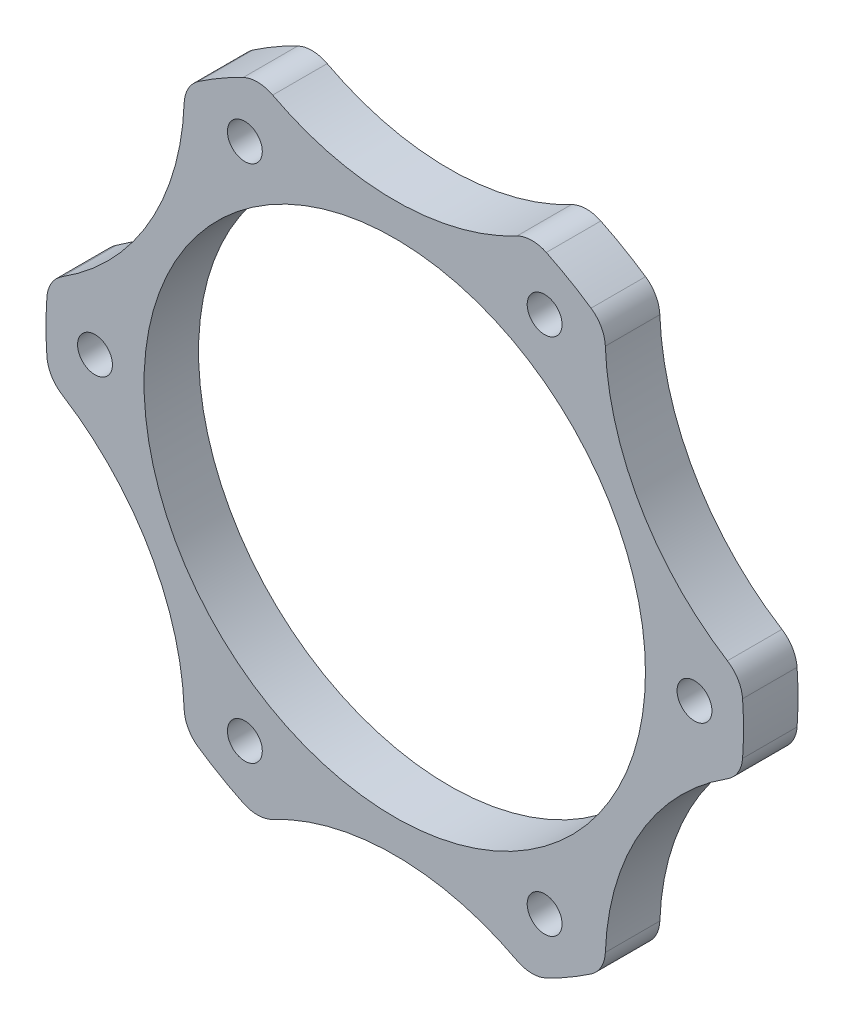
ISO-10303-21;
HEADER;
FILE_DESCRIPTION(('STEP AP214'),'2;1');
FILE_NAME('part.step','',(''),(''),'','','');
FILE_SCHEMA(('AUTOMOTIVE_DESIGN { 1 0 10303 214 1 1 1 1 }'));
ENDSEC;
DATA;
#1=APPLICATION_CONTEXT('core data for automotive mechanical design processes');
#2=APPLICATION_PROTOCOL_DEFINITION('international standard','automotive_design',2000,#1);
#3=PRODUCT_CONTEXT('',#1,'mechanical');
#4=PRODUCT('Part','Part','',(#3));
#5=PRODUCT_RELATED_PRODUCT_CATEGORY('part','',(#4));
#6=PRODUCT_DEFINITION_FORMATION('','',#4);
#7=PRODUCT_DEFINITION_CONTEXT('part definition',#1,'design');
#8=PRODUCT_DEFINITION('design','',#6,#7);
#9=PRODUCT_DEFINITION_SHAPE('','',#8);
#10=(LENGTH_UNIT() NAMED_UNIT(*) SI_UNIT(.MILLI.,.METRE.));
#11=(NAMED_UNIT(*) PLANE_ANGLE_UNIT() SI_UNIT($,.RADIAN.));
#12=(NAMED_UNIT(*) SI_UNIT($,.STERADIAN.) SOLID_ANGLE_UNIT());
#13=UNCERTAINTY_MEASURE_WITH_UNIT(LENGTH_MEASURE(1.E-05),#10,'distance_accuracy_value','');
#14=(GEOMETRIC_REPRESENTATION_CONTEXT(3) GLOBAL_UNCERTAINTY_ASSIGNED_CONTEXT((#13)) GLOBAL_UNIT_ASSIGNED_CONTEXT((#10,
#11,#12)) REPRESENTATION_CONTEXT('',''));
#15=CARTESIAN_POINT('',(0.,0.,0.));
#16=DIRECTION('',(0.,0.,1.));
#17=DIRECTION('',(1.,0.,0.));
#18=AXIS2_PLACEMENT_3D('',#15,#16,#17);
#19=CARTESIAN_POINT('',(0.,0.,5.));
#20=DIRECTION('',(0.,0.,-1.));
#21=DIRECTION('',(-1.,0.,0.));
#22=AXIS2_PLACEMENT_3D('',#19,#20,#21);
#23=CYLINDRICAL_SURFACE('',#22,32.);
#24=CARTESIAN_POINT('',(0.,0.,5.));
#25=DIRECTION('',(0.,0.,1.));
#26=DIRECTION('',(1.,0.,0.));
#27=AXIS2_PLACEMENT_3D('',#24,#25,#26);
#28=CIRCLE('',#27,32.);
#29=CARTESIAN_POINT('',(-18.0092350539192,-26.451227812196,5.));
#30=VERTEX_POINT('',#29);
#31=CARTESIAN_POINT('',(-13.9028177196915,-28.8220689655172,5.));
#32=VERTEX_POINT('',#31);
#33=EDGE_CURVE('E228',#30,#32,#28,.T.);
#34=ORIENTED_EDGE('',*,*,#33,.F.);
#35=DIRECTION('',(0.,0.,-1.));
#36=VECTOR('',#35,1.);
#37=CARTESIAN_POINT('',(-18.0092350539192,-26.451227812196,5.));
#38=LINE('',#37,#36);
#39=CARTESIAN_POINT('',(-18.0092350539192,-26.451227812196,0.));
#40=VERTEX_POINT('',#39);
#41=EDGE_CURVE('E474',#30,#40,#38,.T.);
#42=ORIENTED_EDGE('',*,*,#41,.T.);
#43=CARTESIAN_POINT('',(0.,0.,0.));
#44=DIRECTION('',(0.,0.,1.));
#45=DIRECTION('',(1.,0.,0.));
#46=AXIS2_PLACEMENT_3D('',#43,#44,#45);
#47=CIRCLE('',#46,32.);
#48=CARTESIAN_POINT('',(-13.9028177196915,-28.8220689655172,0.));
#49=VERTEX_POINT('',#48);
#50=EDGE_CURVE('E511',#40,#49,#47,.T.);
#51=ORIENTED_EDGE('',*,*,#50,.T.);
#52=DIRECTION('',(0.,0.,-1.));
#53=VECTOR('',#52,1.);
#54=CARTESIAN_POINT('',(-13.9028177196915,-28.8220689655172,5.));
#55=LINE('',#54,#53);
#56=EDGE_CURVE('E472',#49,#32,#55,.F.);
#57=ORIENTED_EDGE('',*,*,#56,.T.);
#58=EDGE_LOOP('',(#34,#42,#51,#57));
#59=FACE_BOUND('',#58,.T.);
#60=ADVANCED_FACE('F39',(#59),#23,.T.);
#61=CARTESIAN_POINT('',(-31.9120527736108,2.37084115332127,5.));
#62=VERTEX_POINT('',#61);
#63=CARTESIAN_POINT('',(-31.9120527736107,-2.37084115332151,5.));
#64=VERTEX_POINT('',#63);
#65=EDGE_CURVE('E276',#62,#64,#28,.T.);
#66=ORIENTED_EDGE('',*,*,#65,.F.);
#67=DIRECTION('',(0.,0.,-1.));
#68=VECTOR('',#67,1.);
#69=CARTESIAN_POINT('',(-31.9120527736108,2.37084115332127,5.));
#70=LINE('',#69,#68);
#71=CARTESIAN_POINT('',(-31.9120527736108,2.37084115332127,0.));
#72=VERTEX_POINT('',#71);
#73=EDGE_CURVE('E458',#62,#72,#70,.T.);
#74=ORIENTED_EDGE('',*,*,#73,.T.);
#75=CARTESIAN_POINT('',(-31.9120527736107,-2.37084115332151,0.));
#76=VERTEX_POINT('',#75);
#77=EDGE_CURVE('E513',#72,#76,#47,.T.);
#78=ORIENTED_EDGE('',*,*,#77,.T.);
#79=DIRECTION('',(0.,0.,-1.));
#80=VECTOR('',#79,1.);
#81=CARTESIAN_POINT('',(-31.9120527736107,-2.37084115332151,5.));
#82=LINE('',#81,#80);
#83=EDGE_CURVE('E461',#76,#64,#82,.F.);
#84=ORIENTED_EDGE('',*,*,#83,.T.);
#85=EDGE_LOOP('',(#66,#74,#78,#84));
#86=FACE_BOUND('',#85,.T.);
#87=ADVANCED_FACE('F380',(#86),#23,.T.);
#88=CARTESIAN_POINT('',(13.9028177196915,-28.8220689655172,5.));
#89=VERTEX_POINT('',#88);
#90=CARTESIAN_POINT('',(18.0092350539195,-26.4512278121957,5.));
#91=VERTEX_POINT('',#90);
#92=EDGE_CURVE('E229',#89,#91,#28,.T.);
#93=ORIENTED_EDGE('',*,*,#92,.F.);
#94=DIRECTION('',(0.,0.,-1.));
#95=VECTOR('',#94,1.);
#96=CARTESIAN_POINT('',(13.9028177196915,-28.8220689655172,5.));
#97=LINE('',#96,#95);
#98=CARTESIAN_POINT('',(13.9028177196915,-28.8220689655172,0.));
#99=VERTEX_POINT('',#98);
#100=EDGE_CURVE('E484',#89,#99,#97,.T.);
#101=ORIENTED_EDGE('',*,*,#100,.T.);
#102=CARTESIAN_POINT('',(18.0092350539195,-26.4512278121957,0.));
#103=VERTEX_POINT('',#102);
#104=EDGE_CURVE('E359',#99,#103,#47,.T.);
#105=ORIENTED_EDGE('',*,*,#104,.T.);
#106=DIRECTION('',(0.,0.,-1.));
#107=VECTOR('',#106,1.);
#108=CARTESIAN_POINT('',(18.0092350539195,-26.4512278121957,5.));
#109=LINE('',#108,#107);
#110=EDGE_CURVE('E481',#103,#91,#109,.F.);
#111=ORIENTED_EDGE('',*,*,#110,.T.);
#112=EDGE_LOOP('',(#93,#101,#105,#111));
#113=FACE_BOUND('',#112,.T.);
#114=ADVANCED_FACE('F385',(#113),#23,.T.);
#115=CARTESIAN_POINT('',(31.9120527736108,-2.37084115332104,5.));
#116=VERTEX_POINT('',#115);
#117=CARTESIAN_POINT('',(31.9120527736107,2.37084115332171,5.));
#118=VERTEX_POINT('',#117);
#119=EDGE_CURVE('E225',#116,#118,#28,.T.);
#120=ORIENTED_EDGE('',*,*,#119,.F.);
#121=DIRECTION('',(0.,0.,-1.));
#122=VECTOR('',#121,1.);
#123=CARTESIAN_POINT('',(31.9120527736108,-2.37084115332104,5.));
#124=LINE('',#123,#122);
#125=CARTESIAN_POINT('',(31.9120527736108,-2.37084115332104,0.));
#126=VERTEX_POINT('',#125);
#127=EDGE_CURVE('E12',#116,#126,#124,.T.);
#128=ORIENTED_EDGE('',*,*,#127,.T.);
#129=CARTESIAN_POINT('',(31.9120527736107,2.37084115332171,0.));
#130=VERTEX_POINT('',#129);
#131=EDGE_CURVE('E278',#126,#130,#47,.T.);
#132=ORIENTED_EDGE('',*,*,#131,.T.);
#133=DIRECTION('',(0.,0.,-1.));
#134=VECTOR('',#133,1.);
#135=CARTESIAN_POINT('',(31.9120527736107,2.37084115332171,5.));
#136=LINE('',#135,#134);
#137=EDGE_CURVE('E47',#130,#118,#136,.F.);
#138=ORIENTED_EDGE('',*,*,#137,.T.);
#139=EDGE_LOOP('',(#120,#128,#132,#138));
#140=FACE_BOUND('',#139,.T.);
#141=ADVANCED_FACE('F443',(#140),#23,.T.);
#142=CARTESIAN_POINT('',(-13.9028177196915,28.8220689655172,5.));
#143=VERTEX_POINT('',#142);
#144=CARTESIAN_POINT('',(-18.0092350539193,26.4512278121959,5.));
#145=VERTEX_POINT('',#144);
#146=EDGE_CURVE('E236',#143,#145,#28,.T.);
#147=ORIENTED_EDGE('',*,*,#146,.F.);
#148=DIRECTION('',(0.,0.,-1.));
#149=VECTOR('',#148,1.);
#150=CARTESIAN_POINT('',(-13.9028177196915,28.8220689655172,5.));
#151=LINE('',#150,#149);
#152=CARTESIAN_POINT('',(-13.9028177196915,28.8220689655172,0.));
#153=VERTEX_POINT('',#152);
#154=EDGE_CURVE('E538',#143,#153,#151,.T.);
#155=ORIENTED_EDGE('',*,*,#154,.T.);
#156=CARTESIAN_POINT('',(-18.0092350539193,26.4512278121959,0.));
#157=VERTEX_POINT('',#156);
#158=EDGE_CURVE('E226',#153,#157,#47,.T.);
#159=ORIENTED_EDGE('',*,*,#158,.T.);
#160=DIRECTION('',(0.,0.,-1.));
#161=VECTOR('',#160,1.);
#162=CARTESIAN_POINT('',(-18.0092350539193,26.4512278121959,5.));
#163=LINE('',#162,#161);
#164=EDGE_CURVE('E542',#157,#145,#163,.F.);
#165=ORIENTED_EDGE('',*,*,#164,.T.);
#166=EDGE_LOOP('',(#147,#155,#159,#165));
#167=FACE_BOUND('',#166,.T.);
#168=ADVANCED_FACE('F377',(#167),#23,.T.);
#169=CARTESIAN_POINT('',(0.,0.,5.));
#170=DIRECTION('',(0.,0.,1.));
#171=DIRECTION('',(1.,0.,0.));
#172=AXIS2_PLACEMENT_3D('',#169,#170,#171);
#173=PLANE('',#172);
#174=CARTESIAN_POINT('',(-13.7500000000001,23.815698604072,5.));
#175=DIRECTION('',(0.,0.,1.));
#176=DIRECTION('',(0.499999999999998,0.86602540378444,0.));
#177=AXIS2_PLACEMENT_3D('',#174,#175,#176);
#178=CIRCLE('',#177,1.6);
#179=CARTESIAN_POINT('',(-12.9500000000001,25.2013392501271,5.));
#180=VERTEX_POINT('',#179);
#181=EDGE_CURVE('E572',#180,#180,#178,.T.);
#182=ORIENTED_EDGE('',*,*,#181,.F.);
#183=EDGE_LOOP('',(#182));
#184=FACE_BOUND('',#183,.T.);
#185=CARTESIAN_POINT('',(-27.5,-1.97758476261356E-13,5.));
#186=DIRECTION('',(0.,0.,1.));
#187=DIRECTION('',(-0.500000000000004,0.866025403784436,0.));
#188=AXIS2_PLACEMENT_3D('',#185,#186,#187);
#189=CIRCLE('',#188,1.6);
#190=CARTESIAN_POINT('',(-28.3,1.3856406460549,5.));
#191=VERTEX_POINT('',#190);
#192=EDGE_CURVE('E739',#191,#191,#189,.T.);
#193=ORIENTED_EDGE('',*,*,#192,.F.);
#194=EDGE_LOOP('',(#193));
#195=FACE_BOUND('',#194,.T.);
#196=CARTESIAN_POINT('',(-13.7499999999999,-23.8156986040721,5.));
#197=DIRECTION('',(0.,0.,1.));
#198=DIRECTION('',(-1.,0.,0.));
#199=AXIS2_PLACEMENT_3D('',#196,#197,#198);
#200=CIRCLE('',#199,1.6);
#201=CARTESIAN_POINT('',(-15.3499999999999,-23.8156986040721,5.));
#202=VERTEX_POINT('',#201);
#203=EDGE_CURVE('E743',#202,#202,#200,.T.);
#204=ORIENTED_EDGE('',*,*,#203,.F.);
#205=EDGE_LOOP('',(#204));
#206=FACE_BOUND('',#205,.T.);
#207=CARTESIAN_POINT('',(13.7500000000003,-23.8156986040719,5.));
#208=DIRECTION('',(0.,0.,1.));
#209=DIRECTION('',(-0.499999999999992,-0.866025403784443,0.));
#210=AXIS2_PLACEMENT_3D('',#207,#208,#209);
#211=CIRCLE('',#210,1.6);
#212=CARTESIAN_POINT('',(12.9500000000003,-25.201339250127,5.));
#213=VERTEX_POINT('',#212);
#214=EDGE_CURVE('E747',#213,#213,#211,.T.);
#215=ORIENTED_EDGE('',*,*,#214,.F.);
#216=EDGE_LOOP('',(#215));
#217=FACE_BOUND('',#216,.T.);
#218=CARTESIAN_POINT('',(27.5,3.92047505570758E-13,5.));
#219=DIRECTION('',(0.,0.,1.));
#220=DIRECTION('',(0.50000000000001,-0.866025403784433,0.));
#221=AXIS2_PLACEMENT_3D('',#218,#219,#220);
#222=CIRCLE('',#221,1.6);
#223=CARTESIAN_POINT('',(28.3,-1.3856406460547,5.));
#224=VERTEX_POINT('',#223);
#225=EDGE_CURVE('E558',#224,#224,#222,.T.);
#226=ORIENTED_EDGE('',*,*,#225,.F.);
#227=EDGE_LOOP('',(#226));
#228=FACE_BOUND('',#227,.T.);
#229=CARTESIAN_POINT('',(13.7499999999999,23.8156986040721,5.));
#230=DIRECTION('',(0.,0.,1.));
#231=DIRECTION('',(1.,0.,0.));
#232=AXIS2_PLACEMENT_3D('',#229,#230,#231);
#233=CIRCLE('',#232,1.6);
#234=CARTESIAN_POINT('',(15.3499999999999,23.8156986040721,5.));
#235=VERTEX_POINT('',#234);
#236=EDGE_CURVE('E553',#235,#235,#233,.T.);
#237=ORIENTED_EDGE('',*,*,#236,.F.);
#238=EDGE_LOOP('',(#237));
#239=FACE_BOUND('',#238,.T.);
#240=CARTESIAN_POINT('',(43.3012701892216,25.0000000000005,5.));
#241=DIRECTION('',(0.,0.,1.));
#242=DIRECTION('',(0.50000000000001,-0.866025403784433,0.));
#243=AXIS2_PLACEMENT_3D('',#240,#241,#242);
#244=CIRCLE('',#243,24.);
#245=CARTESIAN_POINT('',(19.3186915922371,24.085711293158,5.));
#246=VERTEX_POINT('',#245);
#247=CARTESIAN_POINT('',(30.518183644211,4.68762204017589,5.));
#248=VERTEX_POINT('',#247);
#249=EDGE_CURVE('E209',#246,#248,#244,.T.);
#250=ORIENTED_EDGE('',*,*,#249,.F.);
#251=CARTESIAN_POINT('',(16.320869267614,23.9714252048027,5.));
#252=DIRECTION('',(0.,0.,1.));
#253=DIRECTION('',(1.,0.,0.));
#254=AXIS2_PLACEMENT_3D('',#251,#252,#253);
#255=CIRCLE('',#254,3.);
#256=CARTESIAN_POINT('',(18.0092350539189,26.4512278121961,5.));
#257=VERTEX_POINT('',#256);
#258=EDGE_CURVE('E203',#246,#257,#255,.T.);
#259=ORIENTED_EDGE('',*,*,#258,.T.);
#260=CARTESIAN_POINT('',(13.9028177196915,28.8220689655172,5.));
#261=VERTEX_POINT('',#260);
#262=EDGE_CURVE('E207',#257,#261,#28,.T.);
#263=ORIENTED_EDGE('',*,*,#262,.T.);
#264=CARTESIAN_POINT('',(12.5994285584704,26.12,5.));
#265=DIRECTION('',(0.,0.,1.));
#266=DIRECTION('',(1.,0.,0.));
#267=AXIS2_PLACEMENT_3D('',#264,#265,#266);
#268=CIRCLE('',#267,3.);
#269=CARTESIAN_POINT('',(11.1994920519737,28.7733333333333,5.));
#270=VERTEX_POINT('',#269);
#271=EDGE_CURVE('E214',#261,#270,#268,.T.);
#272=ORIENTED_EDGE('',*,*,#271,.T.);
#273=CARTESIAN_POINT('',(0.,50.,5.));
#274=DIRECTION('',(0.,0.,1.));
#275=DIRECTION('',(1.,0.,0.));
#276=AXIS2_PLACEMENT_3D('',#273,#274,#275);
#277=CIRCLE('',#276,24.);
#278=CARTESIAN_POINT('',(-11.1994920519737,28.7733333333333,5.));
#279=VERTEX_POINT('',#278);
#280=EDGE_CURVE('E344',#279,#270,#277,.T.);
#281=ORIENTED_EDGE('',*,*,#280,.F.);
#282=CARTESIAN_POINT('',(-12.5994285584704,26.12,5.));
#283=DIRECTION('',(0.,0.,1.));
#284=DIRECTION('',(1.,0.,0.));
#285=AXIS2_PLACEMENT_3D('',#282,#283,#284);
#286=CIRCLE('',#285,3.);
#287=EDGE_CURVE('E338',#279,#143,#286,.T.);
#288=ORIENTED_EDGE('',*,*,#287,.T.);
#289=ORIENTED_EDGE('',*,*,#146,.T.);
#290=CARTESIAN_POINT('',(-16.3208692676144,23.9714252048025,5.));
#291=DIRECTION('',(0.,0.,1.));
#292=DIRECTION('',(1.,0.,0.));
#293=AXIS2_PLACEMENT_3D('',#290,#291,#292);
#294=CIRCLE('',#293,3.);
#295=CARTESIAN_POINT('',(-19.3186915922375,24.0857112931578,5.));
#296=VERTEX_POINT('',#295);
#297=EDGE_CURVE('E334',#145,#296,#294,.T.);
#298=ORIENTED_EDGE('',*,*,#297,.T.);
#299=CARTESIAN_POINT('',(-43.301270189222,24.9999999999999,5.));
#300=DIRECTION('',(0.,0.,1.));
#301=DIRECTION('',(0.499999999999998,0.86602540378444,0.));
#302=AXIS2_PLACEMENT_3D('',#299,#300,#301);
#303=CIRCLE('',#302,24.);
#304=CARTESIAN_POINT('',(-30.5181836442111,4.68762204017546,5.));
#305=VERTEX_POINT('',#304);
#306=EDGE_CURVE('E324',#305,#296,#303,.T.);
#307=ORIENTED_EDGE('',*,*,#306,.F.);
#308=CARTESIAN_POINT('',(-28.9202978260848,2.1485747951974,5.));
#309=DIRECTION('',(0.,0.,1.));
#310=DIRECTION('',(1.,0.,0.));
#311=AXIS2_PLACEMENT_3D('',#308,#309,#310);
#312=CIRCLE('',#311,3.);
#313=EDGE_CURVE('E331',#305,#62,#312,.T.);
#314=ORIENTED_EDGE('',*,*,#313,.T.);
#315=ORIENTED_EDGE('',*,*,#65,.T.);
#316=CARTESIAN_POINT('',(-28.9202978260847,-2.14857479519762,5.));
#317=DIRECTION('',(0.,0.,1.));
#318=DIRECTION('',(1.,0.,0.));
#319=AXIS2_PLACEMENT_3D('',#316,#317,#318);
#320=CIRCLE('',#319,3.);
#321=CARTESIAN_POINT('',(-30.5181836442111,-4.68762204017568,5.));
#322=VERTEX_POINT('',#321);
#323=EDGE_CURVE('E328',#64,#322,#320,.T.);
#324=ORIENTED_EDGE('',*,*,#323,.T.);
#325=CARTESIAN_POINT('',(-43.3012701892218,-25.0000000000002,5.));
#326=DIRECTION('',(0.,0.,1.));
#327=DIRECTION('',(-0.500000000000004,0.866025403784436,0.));
#328=AXIS2_PLACEMENT_3D('',#325,#326,#327);
#329=CIRCLE('',#328,24.);
#330=CARTESIAN_POINT('',(-19.3186915922373,-24.0857112931579,5.));
#331=VERTEX_POINT('',#330);
#332=EDGE_CURVE('E318',#331,#322,#329,.T.);
#333=ORIENTED_EDGE('',*,*,#332,.F.);
#334=CARTESIAN_POINT('',(-16.3208692676142,-23.9714252048026,5.));
#335=DIRECTION('',(0.,0.,1.));
#336=DIRECTION('',(1.,0.,0.));
#337=AXIS2_PLACEMENT_3D('',#334,#335,#336);
#338=CIRCLE('',#337,3.);
#339=EDGE_CURVE('E62',#331,#30,#338,.T.);
#340=ORIENTED_EDGE('',*,*,#339,.T.);
#341=ORIENTED_EDGE('',*,*,#33,.T.);
#342=CARTESIAN_POINT('',(-12.5994285584704,-26.12,5.));
#343=DIRECTION('',(0.,0.,1.));
#344=DIRECTION('',(1.,0.,0.));
#345=AXIS2_PLACEMENT_3D('',#342,#343,#344);
#346=CIRCLE('',#345,3.);
#347=CARTESIAN_POINT('',(-11.1994920519737,-28.7733333333333,5.));
#348=VERTEX_POINT('',#347);
#349=EDGE_CURVE('E54',#32,#348,#346,.T.);
#350=ORIENTED_EDGE('',*,*,#349,.T.);
#351=CARTESIAN_POINT('',(0.,-50.,5.));
#352=DIRECTION('',(0.,0.,1.));
#353=DIRECTION('',(-1.,0.,0.));
#354=AXIS2_PLACEMENT_3D('',#351,#352,#353);
#355=CIRCLE('',#354,24.);
#356=CARTESIAN_POINT('',(11.1994920519737,-28.7733333333333,5.));
#357=VERTEX_POINT('',#356);
#358=EDGE_CURVE('E313',#357,#348,#355,.T.);
#359=ORIENTED_EDGE('',*,*,#358,.F.);
#360=CARTESIAN_POINT('',(12.5994285584704,-26.12,5.));
#361=DIRECTION('',(0.,0.,1.));
#362=DIRECTION('',(1.,0.,0.));
#363=AXIS2_PLACEMENT_3D('',#360,#361,#362);
#364=CIRCLE('',#363,3.);
#365=EDGE_CURVE('E305',#357,#89,#364,.T.);
#366=ORIENTED_EDGE('',*,*,#365,.T.);
#367=ORIENTED_EDGE('',*,*,#92,.T.);
#368=CARTESIAN_POINT('',(16.3208692676146,-23.9714252048024,5.));
#369=DIRECTION('',(0.,0.,1.));
#370=DIRECTION('',(1.,0.,0.));
#371=AXIS2_PLACEMENT_3D('',#368,#369,#370);
#372=CIRCLE('',#371,3.);
#373=CARTESIAN_POINT('',(19.3186915922376,-24.0857112931576,5.));
#374=VERTEX_POINT('',#373);
#375=EDGE_CURVE('E303',#91,#374,#372,.T.);
#376=ORIENTED_EDGE('',*,*,#375,.T.);
#377=CARTESIAN_POINT('',(43.3012701892222,-24.9999999999996,5.));
#378=DIRECTION('',(0.,0.,1.));
#379=DIRECTION('',(-0.499999999999992,-0.866025403784443,0.));
#380=AXIS2_PLACEMENT_3D('',#377,#378,#379);
#381=CIRCLE('',#380,24.);
#382=CARTESIAN_POINT('',(30.5181836442111,-4.68762204017524,5.));
#383=VERTEX_POINT('',#382);
#384=EDGE_CURVE('E319',#383,#374,#381,.T.);
#385=ORIENTED_EDGE('',*,*,#384,.F.);
#386=CARTESIAN_POINT('',(28.9202978260848,-2.1485747951972,5.));
#387=DIRECTION('',(0.,0.,1.));
#388=DIRECTION('',(1.,0.,0.));
#389=AXIS2_PLACEMENT_3D('',#386,#387,#388);
#390=CIRCLE('',#389,3.);
#391=EDGE_CURVE('E267',#383,#116,#390,.T.);
#392=ORIENTED_EDGE('',*,*,#391,.T.);
#393=ORIENTED_EDGE('',*,*,#119,.T.);
#394=CARTESIAN_POINT('',(28.9202978260847,2.1485747951978,5.));
#395=DIRECTION('',(0.,0.,1.));
#396=DIRECTION('',(1.,0.,0.));
#397=AXIS2_PLACEMENT_3D('',#394,#395,#396);
#398=CIRCLE('',#397,3.);
#399=EDGE_CURVE('E264',#118,#248,#398,.T.);
#400=ORIENTED_EDGE('',*,*,#399,.T.);
#401=EDGE_LOOP('',(#250,#259,#263,#272,#281,#288,#289,#298,#307,#314,#315,#324,#333,#340,#341,
#350,#359,#366,#367,#376,#385,#392,#393,#400));
#402=FACE_BOUND('',#401,.T.);
#403=CARTESIAN_POINT('',(0.,0.,5.));
#404=DIRECTION('',(0.,0.,1.));
#405=DIRECTION('',(1.,0.,0.));
#406=AXIS2_PLACEMENT_3D('',#403,#404,#405);
#407=CIRCLE('',#406,23.);
#408=CARTESIAN_POINT('',(23.,0.,5.));
#409=VERTEX_POINT('',#408);
#410=EDGE_CURVE('E353',#409,#409,#407,.T.);
#411=ORIENTED_EDGE('',*,*,#410,.F.);
#412=EDGE_LOOP('',(#411));
#413=FACE_BOUND('',#412,.T.);
#414=ADVANCED_FACE('F205',(#184,#195,#206,#217,#228,#239,#402,#413),#173,.T.);
#415=CARTESIAN_POINT('',(0.,0.,0.));
#416=DIRECTION('',(0.,0.,1.));
#417=DIRECTION('',(1.,0.,0.));
#418=AXIS2_PLACEMENT_3D('',#415,#416,#417);
#419=PLANE('',#418);
#420=CARTESIAN_POINT('',(-13.7500000000001,23.815698604072,0.));
#421=DIRECTION('',(0.,0.,1.));
#422=DIRECTION('',(1.,0.,0.));
#423=AXIS2_PLACEMENT_3D('',#420,#421,#422);
#424=CIRCLE('',#423,1.6);
#425=CARTESIAN_POINT('',(-12.1500000000001,23.815698604072,0.));
#426=VERTEX_POINT('',#425);
#427=EDGE_CURVE('E557',#426,#426,#424,.T.);
#428=ORIENTED_EDGE('',*,*,#427,.T.);
#429=EDGE_LOOP('',(#428));
#430=FACE_BOUND('',#429,.T.);
#431=CARTESIAN_POINT('',(-27.5,-1.97758476261356E-13,0.));
#432=DIRECTION('',(0.,0.,1.));
#433=DIRECTION('',(1.,0.,0.));
#434=AXIS2_PLACEMENT_3D('',#431,#432,#433);
#435=CIRCLE('',#434,1.6);
#436=CARTESIAN_POINT('',(-25.9,-1.97758476261356E-13,0.));
#437=VERTEX_POINT('',#436);
#438=EDGE_CURVE('E578',#437,#437,#435,.T.);
#439=ORIENTED_EDGE('',*,*,#438,.T.);
#440=EDGE_LOOP('',(#439));
#441=FACE_BOUND('',#440,.T.);
#442=CARTESIAN_POINT('',(-13.7499999999999,-23.8156986040721,0.));
#443=DIRECTION('',(0.,0.,1.));
#444=DIRECTION('',(1.,0.,0.));
#445=AXIS2_PLACEMENT_3D('',#442,#443,#444);
#446=CIRCLE('',#445,1.6);
#447=CARTESIAN_POINT('',(-12.1499999999999,-23.8156986040721,0.));
#448=VERTEX_POINT('',#447);
#449=EDGE_CURVE('E575',#448,#448,#446,.T.);
#450=ORIENTED_EDGE('',*,*,#449,.T.);
#451=EDGE_LOOP('',(#450));
#452=FACE_BOUND('',#451,.T.);
#453=CARTESIAN_POINT('',(13.7500000000003,-23.8156986040719,0.));
#454=DIRECTION('',(0.,0.,1.));
#455=DIRECTION('',(1.,0.,0.));
#456=AXIS2_PLACEMENT_3D('',#453,#454,#455);
#457=CIRCLE('',#456,1.6);
#458=CARTESIAN_POINT('',(15.3500000000003,-23.8156986040719,0.));
#459=VERTEX_POINT('',#458);
#460=EDGE_CURVE('E571',#459,#459,#457,.T.);
#461=ORIENTED_EDGE('',*,*,#460,.T.);
#462=EDGE_LOOP('',(#461));
#463=FACE_BOUND('',#462,.T.);
#464=CARTESIAN_POINT('',(27.5,3.92047505570758E-13,0.));
#465=DIRECTION('',(0.,0.,1.));
#466=DIRECTION('',(1.,0.,0.));
#467=AXIS2_PLACEMENT_3D('',#464,#465,#466);
#468=CIRCLE('',#467,1.6);
#469=CARTESIAN_POINT('',(29.1,3.92047505570758E-13,0.));
#470=VERTEX_POINT('',#469);
#471=EDGE_CURVE('E568',#470,#470,#468,.T.);
#472=ORIENTED_EDGE('',*,*,#471,.T.);
#473=EDGE_LOOP('',(#472));
#474=FACE_BOUND('',#473,.T.);
#475=CARTESIAN_POINT('',(13.7499999999999,23.8156986040721,0.));
#476=DIRECTION('',(0.,0.,1.));
#477=DIRECTION('',(1.,0.,0.));
#478=AXIS2_PLACEMENT_3D('',#475,#476,#477);
#479=CIRCLE('',#478,1.6);
#480=CARTESIAN_POINT('',(15.3499999999999,23.8156986040721,0.));
#481=VERTEX_POINT('',#480);
#482=EDGE_CURVE('E556',#481,#481,#479,.T.);
#483=ORIENTED_EDGE('',*,*,#482,.T.);
#484=EDGE_LOOP('',(#483));
#485=FACE_BOUND('',#484,.T.);
#486=CARTESIAN_POINT('',(18.0092350539189,26.4512278121961,0.));
#487=VERTEX_POINT('',#486);
#488=CARTESIAN_POINT('',(13.9028177196915,28.8220689655172,0.));
#489=VERTEX_POINT('',#488);
#490=EDGE_CURVE('E356',#487,#489,#47,.T.);
#491=ORIENTED_EDGE('',*,*,#490,.F.);
#492=CARTESIAN_POINT('',(16.320869267614,23.9714252048027,0.));
#493=DIRECTION('',(0.,0.,1.));
#494=DIRECTION('',(1.,0.,0.));
#495=AXIS2_PLACEMENT_3D('',#492,#493,#494);
#496=CIRCLE('',#495,3.);
#497=CARTESIAN_POINT('',(19.3186915922371,24.085711293158,0.));
#498=VERTEX_POINT('',#497);
#499=EDGE_CURVE('E231',#487,#498,#496,.F.);
#500=ORIENTED_EDGE('',*,*,#499,.T.);
#501=CARTESIAN_POINT('',(43.3012701892216,25.0000000000005,0.));
#502=DIRECTION('',(0.,0.,1.));
#503=DIRECTION('',(1.,0.,0.));
#504=AXIS2_PLACEMENT_3D('',#501,#502,#503);
#505=CIRCLE('',#504,24.);
#506=CARTESIAN_POINT('',(30.518183644211,4.68762204017589,0.));
#507=VERTEX_POINT('',#506);
#508=EDGE_CURVE('E500',#498,#507,#505,.T.);
#509=ORIENTED_EDGE('',*,*,#508,.T.);
#510=CARTESIAN_POINT('',(28.9202978260847,2.1485747951978,0.));
#511=DIRECTION('',(0.,0.,1.));
#512=DIRECTION('',(1.,0.,0.));
#513=AXIS2_PLACEMENT_3D('',#510,#511,#512);
#514=CIRCLE('',#513,3.);
#515=EDGE_CURVE('E232',#507,#130,#514,.F.);
#516=ORIENTED_EDGE('',*,*,#515,.T.);
#517=ORIENTED_EDGE('',*,*,#131,.F.);
#518=CARTESIAN_POINT('',(28.9202978260848,-2.1485747951972,0.));
#519=DIRECTION('',(0.,0.,1.));
#520=DIRECTION('',(1.,0.,0.));
#521=AXIS2_PLACEMENT_3D('',#518,#519,#520);
#522=CIRCLE('',#521,3.);
#523=CARTESIAN_POINT('',(30.5181836442111,-4.68762204017524,0.));
#524=VERTEX_POINT('',#523);
#525=EDGE_CURVE('E234',#126,#524,#522,.F.);
#526=ORIENTED_EDGE('',*,*,#525,.T.);
#527=CARTESIAN_POINT('',(43.3012701892222,-24.9999999999996,0.));
#528=DIRECTION('',(0.,0.,1.));
#529=DIRECTION('',(1.,0.,0.));
#530=AXIS2_PLACEMENT_3D('',#527,#528,#529);
#531=CIRCLE('',#530,24.);
#532=CARTESIAN_POINT('',(19.3186915922376,-24.0857112931576,0.));
#533=VERTEX_POINT('',#532);
#534=EDGE_CURVE('E494',#524,#533,#531,.T.);
#535=ORIENTED_EDGE('',*,*,#534,.T.);
#536=CARTESIAN_POINT('',(16.3208692676146,-23.9714252048024,0.));
#537=DIRECTION('',(0.,0.,1.));
#538=DIRECTION('',(1.,0.,0.));
#539=AXIS2_PLACEMENT_3D('',#536,#537,#538);
#540=CIRCLE('',#539,3.);
#541=EDGE_CURVE('E241',#533,#103,#540,.F.);
#542=ORIENTED_EDGE('',*,*,#541,.T.);
#543=ORIENTED_EDGE('',*,*,#104,.F.);
#544=CARTESIAN_POINT('',(12.5994285584704,-26.12,0.));
#545=DIRECTION('',(0.,0.,1.));
#546=DIRECTION('',(1.,0.,0.));
#547=AXIS2_PLACEMENT_3D('',#544,#545,#546);
#548=CIRCLE('',#547,3.);
#549=CARTESIAN_POINT('',(11.1994920519737,-28.7733333333333,0.));
#550=VERTEX_POINT('',#549);
#551=EDGE_CURVE('E243',#99,#550,#548,.F.);
#552=ORIENTED_EDGE('',*,*,#551,.T.);
#553=CARTESIAN_POINT('',(0.,-50.,0.));
#554=DIRECTION('',(0.,0.,1.));
#555=DIRECTION('',(1.,0.,0.));
#556=AXIS2_PLACEMENT_3D('',#553,#554,#555);
#557=CIRCLE('',#556,24.);
#558=CARTESIAN_POINT('',(-11.1994920519737,-28.7733333333333,0.));
#559=VERTEX_POINT('',#558);
#560=EDGE_CURVE('E350',#550,#559,#557,.T.);
#561=ORIENTED_EDGE('',*,*,#560,.T.);
#562=CARTESIAN_POINT('',(-12.5994285584704,-26.12,0.));
#563=DIRECTION('',(0.,0.,1.));
#564=DIRECTION('',(1.,0.,0.));
#565=AXIS2_PLACEMENT_3D('',#562,#563,#564);
#566=CIRCLE('',#565,3.);
#567=EDGE_CURVE('E245',#559,#49,#566,.F.);
#568=ORIENTED_EDGE('',*,*,#567,.T.);
#569=ORIENTED_EDGE('',*,*,#50,.F.);
#570=CARTESIAN_POINT('',(-16.3208692676142,-23.9714252048026,0.));
#571=DIRECTION('',(0.,0.,1.));
#572=DIRECTION('',(1.,0.,0.));
#573=AXIS2_PLACEMENT_3D('',#570,#571,#572);
#574=CIRCLE('',#573,3.);
#575=CARTESIAN_POINT('',(-19.3186915922373,-24.0857112931579,0.));
#576=VERTEX_POINT('',#575);
#577=EDGE_CURVE('E247',#40,#576,#574,.F.);
#578=ORIENTED_EDGE('',*,*,#577,.T.);
#579=CARTESIAN_POINT('',(-43.3012701892218,-25.0000000000002,0.));
#580=DIRECTION('',(0.,0.,1.));
#581=DIRECTION('',(1.,0.,0.));
#582=AXIS2_PLACEMENT_3D('',#579,#580,#581);
#583=CIRCLE('',#582,24.);
#584=CARTESIAN_POINT('',(-30.5181836442111,-4.68762204017568,0.));
#585=VERTEX_POINT('',#584);
#586=EDGE_CURVE('E499',#576,#585,#583,.T.);
#587=ORIENTED_EDGE('',*,*,#586,.T.);
#588=CARTESIAN_POINT('',(-28.9202978260847,-2.14857479519762,0.));
#589=DIRECTION('',(0.,0.,1.));
#590=DIRECTION('',(1.,0.,0.));
#591=AXIS2_PLACEMENT_3D('',#588,#589,#590);
#592=CIRCLE('',#591,3.);
#593=EDGE_CURVE('E249',#585,#76,#592,.F.);
#594=ORIENTED_EDGE('',*,*,#593,.T.);
#595=ORIENTED_EDGE('',*,*,#77,.F.);
#596=CARTESIAN_POINT('',(-28.9202978260848,2.1485747951974,0.));
#597=DIRECTION('',(0.,0.,1.));
#598=DIRECTION('',(1.,0.,0.));
#599=AXIS2_PLACEMENT_3D('',#596,#597,#598);
#600=CIRCLE('',#599,3.);
#601=CARTESIAN_POINT('',(-30.5181836442111,4.68762204017546,0.));
#602=VERTEX_POINT('',#601);
#603=EDGE_CURVE('E251',#72,#602,#600,.F.);
#604=ORIENTED_EDGE('',*,*,#603,.T.);
#605=CARTESIAN_POINT('',(-43.301270189222,24.9999999999999,0.));
#606=DIRECTION('',(0.,0.,1.));
#607=DIRECTION('',(1.,0.,0.));
#608=AXIS2_PLACEMENT_3D('',#605,#606,#607);
#609=CIRCLE('',#608,24.);
#610=CARTESIAN_POINT('',(-19.3186915922375,24.0857112931578,0.));
#611=VERTEX_POINT('',#610);
#612=EDGE_CURVE('E530',#602,#611,#609,.T.);
#613=ORIENTED_EDGE('',*,*,#612,.T.);
#614=CARTESIAN_POINT('',(-16.3208692676144,23.9714252048025,0.));
#615=DIRECTION('',(0.,0.,1.));
#616=DIRECTION('',(1.,0.,0.));
#617=AXIS2_PLACEMENT_3D('',#614,#615,#616);
#618=CIRCLE('',#617,3.);
#619=EDGE_CURVE('E253',#611,#157,#618,.F.);
#620=ORIENTED_EDGE('',*,*,#619,.T.);
#621=ORIENTED_EDGE('',*,*,#158,.F.);
#622=CARTESIAN_POINT('',(-12.5994285584704,26.12,0.));
#623=DIRECTION('',(0.,0.,1.));
#624=DIRECTION('',(1.,0.,0.));
#625=AXIS2_PLACEMENT_3D('',#622,#623,#624);
#626=CIRCLE('',#625,3.);
#627=CARTESIAN_POINT('',(-11.1994920519737,28.7733333333333,0.));
#628=VERTEX_POINT('',#627);
#629=EDGE_CURVE('E255',#153,#628,#626,.F.);
#630=ORIENTED_EDGE('',*,*,#629,.T.);
#631=CARTESIAN_POINT('',(0.,50.,0.));
#632=DIRECTION('',(0.,0.,1.));
#633=DIRECTION('',(1.,0.,0.));
#634=AXIS2_PLACEMENT_3D('',#631,#632,#633);
#635=CIRCLE('',#634,24.);
#636=CARTESIAN_POINT('',(11.1994920519737,28.7733333333333,0.));
#637=VERTEX_POINT('',#636);
#638=EDGE_CURVE('E349',#628,#637,#635,.T.);
#639=ORIENTED_EDGE('',*,*,#638,.T.);
#640=CARTESIAN_POINT('',(12.5994285584704,26.12,0.));
#641=DIRECTION('',(0.,0.,1.));
#642=DIRECTION('',(1.,0.,0.));
#643=AXIS2_PLACEMENT_3D('',#640,#641,#642);
#644=CIRCLE('',#643,3.);
#645=EDGE_CURVE('E257',#637,#489,#644,.F.);
#646=ORIENTED_EDGE('',*,*,#645,.T.);
#647=EDGE_LOOP('',(#491,#500,#509,#516,#517,#526,#535,#542,#543,#552,#561,#568,#569,#578,#587,
#594,#595,#604,#613,#620,#621,#630,#639,#646));
#648=FACE_BOUND('',#647,.T.);
#649=CARTESIAN_POINT('',(0.,0.,0.));
#650=DIRECTION('',(0.,0.,1.));
#651=DIRECTION('',(1.,0.,0.));
#652=AXIS2_PLACEMENT_3D('',#649,#650,#651);
#653=CIRCLE('',#652,23.);
#654=CARTESIAN_POINT('',(23.,0.,0.));
#655=VERTEX_POINT('',#654);
#656=EDGE_CURVE('E277',#655,#655,#653,.T.);
#657=ORIENTED_EDGE('',*,*,#656,.T.);
#658=EDGE_LOOP('',(#657));
#659=FACE_BOUND('',#658,.T.);
#660=ADVANCED_FACE('F363',(#430,#441,#452,#463,#474,#485,#648,#659),#419,.F.);
#661=ORIENTED_EDGE('',*,*,#262,.F.);
#662=DIRECTION('',(0.,0.,-1.));
#663=VECTOR('',#662,1.);
#664=CARTESIAN_POINT('',(18.0092350539189,26.4512278121961,5.));
#665=LINE('',#664,#663);
#666=EDGE_CURVE('E221',#257,#487,#665,.T.);
#667=ORIENTED_EDGE('',*,*,#666,.T.);
#668=ORIENTED_EDGE('',*,*,#490,.T.);
#669=DIRECTION('',(0.,0.,-1.));
#670=VECTOR('',#669,1.);
#671=CARTESIAN_POINT('',(13.9028177196915,28.8220689655172,5.));
#672=LINE('',#671,#670);
#673=EDGE_CURVE('E224',#489,#261,#672,.F.);
#674=ORIENTED_EDGE('',*,*,#673,.T.);
#675=EDGE_LOOP('',(#661,#667,#668,#674));
#676=FACE_BOUND('',#675,.T.);
#677=ADVANCED_FACE('F219',(#676),#23,.T.);
#678=CARTESIAN_POINT('',(0.,0.,5.));
#679=DIRECTION('',(0.,0.,-1.));
#680=DIRECTION('',(-1.,0.,0.));
#681=AXIS2_PLACEMENT_3D('',#678,#679,#680);
#682=CYLINDRICAL_SURFACE('',#681,23.);
#683=ORIENTED_EDGE('',*,*,#410,.T.);
#684=EDGE_LOOP('',(#683));
#685=FACE_BOUND('',#684,.T.);
#686=ORIENTED_EDGE('',*,*,#656,.F.);
#687=EDGE_LOOP('',(#686));
#688=FACE_BOUND('',#687,.T.);
#689=ADVANCED_FACE('F365',(#685,#688),#682,.F.);
#690=CARTESIAN_POINT('',(0.,50.,-5.));
#691=DIRECTION('',(0.,0.,1.));
#692=DIRECTION('',(1.,0.,0.));
#693=AXIS2_PLACEMENT_3D('',#690,#691,#692);
#694=CYLINDRICAL_SURFACE('',#693,24.);
#695=ORIENTED_EDGE('',*,*,#280,.T.);
#696=DIRECTION('',(0.,0.,1.));
#697=VECTOR('',#696,1.);
#698=CARTESIAN_POINT('',(11.1994920519737,28.7733333333333,-5.));
#699=LINE('',#698,#697);
#700=EDGE_CURVE('E544',#270,#637,#699,.F.);
#701=ORIENTED_EDGE('',*,*,#700,.T.);
#702=ORIENTED_EDGE('',*,*,#638,.F.);
#703=DIRECTION('',(0.,0.,1.));
#704=VECTOR('',#703,1.);
#705=CARTESIAN_POINT('',(-11.1994920519737,28.7733333333333,-5.));
#706=LINE('',#705,#704);
#707=EDGE_CURVE('E213',#628,#279,#706,.T.);
#708=ORIENTED_EDGE('',*,*,#707,.T.);
#709=EDGE_LOOP('',(#695,#701,#702,#708));
#710=FACE_BOUND('',#709,.T.);
#711=ADVANCED_FACE('F367',(#710),#694,.F.);
#712=CARTESIAN_POINT('',(-43.301270189222,24.9999999999999,-5.));
#713=DIRECTION('',(0.,0.,1.));
#714=DIRECTION('',(1.,0.,0.));
#715=AXIS2_PLACEMENT_3D('',#712,#713,#714);
#716=CYLINDRICAL_SURFACE('',#715,24.);
#717=ORIENTED_EDGE('',*,*,#306,.T.);
#718=DIRECTION('',(0.,0.,1.));
#719=VECTOR('',#718,1.);
#720=CARTESIAN_POINT('',(-19.3186915922375,24.0857112931578,-5.));
#721=LINE('',#720,#719);
#722=EDGE_CURVE('E467',#296,#611,#721,.F.);
#723=ORIENTED_EDGE('',*,*,#722,.T.);
#724=ORIENTED_EDGE('',*,*,#612,.F.);
#725=DIRECTION('',(0.,0.,1.));
#726=VECTOR('',#725,1.);
#727=CARTESIAN_POINT('',(-30.5181836442111,4.68762204017546,-5.));
#728=LINE('',#727,#726);
#729=EDGE_CURVE('E537',#602,#305,#728,.T.);
#730=ORIENTED_EDGE('',*,*,#729,.T.);
#731=EDGE_LOOP('',(#717,#723,#724,#730));
#732=FACE_BOUND('',#731,.T.);
#733=ADVANCED_FACE('F373',(#732),#716,.F.);
#734=CARTESIAN_POINT('',(43.3012701892216,25.0000000000005,-5.));
#735=DIRECTION('',(0.,0.,1.));
#736=DIRECTION('',(1.,0.,0.));
#737=AXIS2_PLACEMENT_3D('',#734,#735,#736);
#738=CYLINDRICAL_SURFACE('',#737,24.);
#739=ORIENTED_EDGE('',*,*,#508,.F.);
#740=DIRECTION('',(0.,0.,1.));
#741=VECTOR('',#740,1.);
#742=CARTESIAN_POINT('',(19.3186915922371,24.085711293158,-5.));
#743=LINE('',#742,#741);
#744=EDGE_CURVE('E262',#498,#246,#743,.T.);
#745=ORIENTED_EDGE('',*,*,#744,.T.);
#746=ORIENTED_EDGE('',*,*,#249,.T.);
#747=DIRECTION('',(0.,0.,1.));
#748=VECTOR('',#747,1.);
#749=CARTESIAN_POINT('',(30.518183644211,4.68762204017588,-5.));
#750=LINE('',#749,#748);
#751=EDGE_CURVE('E260',#248,#507,#750,.F.);
#752=ORIENTED_EDGE('',*,*,#751,.T.);
#753=EDGE_LOOP('',(#739,#745,#746,#752));
#754=FACE_BOUND('',#753,.T.);
#755=ADVANCED_FACE('F615',(#754),#738,.F.);
#756=CARTESIAN_POINT('',(43.3012701892222,-24.9999999999996,-5.));
#757=DIRECTION('',(0.,0.,1.));
#758=DIRECTION('',(1.,0.,0.));
#759=AXIS2_PLACEMENT_3D('',#756,#757,#758);
#760=CYLINDRICAL_SURFACE('',#759,24.);
#761=ORIENTED_EDGE('',*,*,#384,.T.);
#762=DIRECTION('',(0.,0.,1.));
#763=VECTOR('',#762,1.);
#764=CARTESIAN_POINT('',(19.3186915922376,-24.0857112931576,-5.));
#765=LINE('',#764,#763);
#766=EDGE_CURVE('E488',#374,#533,#765,.F.);
#767=ORIENTED_EDGE('',*,*,#766,.T.);
#768=ORIENTED_EDGE('',*,*,#534,.F.);
#769=DIRECTION('',(0.,0.,1.));
#770=VECTOR('',#769,1.);
#771=CARTESIAN_POINT('',(30.5181836442111,-4.68762204017524,-5.));
#772=LINE('',#771,#770);
#773=EDGE_CURVE('E436',#524,#383,#772,.T.);
#774=ORIENTED_EDGE('',*,*,#773,.T.);
#775=EDGE_LOOP('',(#761,#767,#768,#774));
#776=FACE_BOUND('',#775,.T.);
#777=ADVANCED_FACE('F493',(#776),#760,.F.);
#778=CARTESIAN_POINT('',(-43.3012701892218,-25.0000000000002,-5.));
#779=DIRECTION('',(0.,0.,1.));
#780=DIRECTION('',(1.,0.,0.));
#781=AXIS2_PLACEMENT_3D('',#778,#779,#780);
#782=CYLINDRICAL_SURFACE('',#781,24.);
#783=ORIENTED_EDGE('',*,*,#332,.T.);
#784=DIRECTION('',(0.,0.,1.));
#785=VECTOR('',#784,1.);
#786=CARTESIAN_POINT('',(-30.5181836442111,-4.68762204017568,-5.));
#787=LINE('',#786,#785);
#788=EDGE_CURVE('E465',#322,#585,#787,.F.);
#789=ORIENTED_EDGE('',*,*,#788,.T.);
#790=ORIENTED_EDGE('',*,*,#586,.F.);
#791=DIRECTION('',(0.,0.,1.));
#792=VECTOR('',#791,1.);
#793=CARTESIAN_POINT('',(-19.3186915922373,-24.0857112931579,-5.));
#794=LINE('',#793,#792);
#795=EDGE_CURVE('E463',#576,#331,#794,.T.);
#796=ORIENTED_EDGE('',*,*,#795,.T.);
#797=EDGE_LOOP('',(#783,#789,#790,#796));
#798=FACE_BOUND('',#797,.T.);
#799=ADVANCED_FACE('F525',(#798),#782,.F.);
#800=CARTESIAN_POINT('',(0.,-50.,-5.));
#801=DIRECTION('',(0.,0.,1.));
#802=DIRECTION('',(1.,0.,0.));
#803=AXIS2_PLACEMENT_3D('',#800,#801,#802);
#804=CYLINDRICAL_SURFACE('',#803,24.);
#805=ORIENTED_EDGE('',*,*,#358,.T.);
#806=DIRECTION('',(0.,0.,1.));
#807=VECTOR('',#806,1.);
#808=CARTESIAN_POINT('',(-11.1994920519737,-28.7733333333333,-5.));
#809=LINE('',#808,#807);
#810=EDGE_CURVE('E479',#348,#559,#809,.F.);
#811=ORIENTED_EDGE('',*,*,#810,.T.);
#812=ORIENTED_EDGE('',*,*,#560,.F.);
#813=DIRECTION('',(0.,0.,1.));
#814=VECTOR('',#813,1.);
#815=CARTESIAN_POINT('',(11.1994920519737,-28.7733333333333,-5.));
#816=LINE('',#815,#814);
#817=EDGE_CURVE('E477',#550,#357,#816,.T.);
#818=ORIENTED_EDGE('',*,*,#817,.T.);
#819=EDGE_LOOP('',(#805,#811,#812,#818));
#820=FACE_BOUND('',#819,.T.);
#821=ADVANCED_FACE('F611',(#820),#804,.F.);
#822=CARTESIAN_POINT('',(13.7499999999999,23.8156986040721,-5.));
#823=DIRECTION('',(0.,0.,1.));
#824=DIRECTION('',(1.,0.,0.));
#825=AXIS2_PLACEMENT_3D('',#822,#823,#824);
#826=CYLINDRICAL_SURFACE('',#825,1.6);
#827=ORIENTED_EDGE('',*,*,#236,.T.);
#828=EDGE_LOOP('',(#827));
#829=FACE_BOUND('',#828,.T.);
#830=ORIENTED_EDGE('',*,*,#482,.F.);
#831=EDGE_LOOP('',(#830));
#832=FACE_BOUND('',#831,.T.);
#833=ADVANCED_FACE('F607',(#829,#832),#826,.F.);
#834=CARTESIAN_POINT('',(27.5,3.92047505570758E-13,-5.));
#835=DIRECTION('',(0.,0.,1.));
#836=DIRECTION('',(1.,0.,0.));
#837=AXIS2_PLACEMENT_3D('',#834,#835,#836);
#838=CYLINDRICAL_SURFACE('',#837,1.6);
#839=ORIENTED_EDGE('',*,*,#225,.T.);
#840=EDGE_LOOP('',(#839));
#841=FACE_BOUND('',#840,.T.);
#842=ORIENTED_EDGE('',*,*,#471,.F.);
#843=EDGE_LOOP('',(#842));
#844=FACE_BOUND('',#843,.T.);
#845=ADVANCED_FACE('F603',(#841,#844),#838,.F.);
#846=CARTESIAN_POINT('',(13.7500000000003,-23.8156986040719,-5.));
#847=DIRECTION('',(0.,0.,1.));
#848=DIRECTION('',(1.,0.,0.));
#849=AXIS2_PLACEMENT_3D('',#846,#847,#848);
#850=CYLINDRICAL_SURFACE('',#849,1.6);
#851=ORIENTED_EDGE('',*,*,#214,.T.);
#852=EDGE_LOOP('',(#851));
#853=FACE_BOUND('',#852,.T.);
#854=ORIENTED_EDGE('',*,*,#460,.F.);
#855=EDGE_LOOP('',(#854));
#856=FACE_BOUND('',#855,.T.);
#857=ADVANCED_FACE('F599',(#853,#856),#850,.F.);
#858=CARTESIAN_POINT('',(-13.7499999999999,-23.8156986040721,-5.));
#859=DIRECTION('',(0.,0.,1.));
#860=DIRECTION('',(1.,0.,0.));
#861=AXIS2_PLACEMENT_3D('',#858,#859,#860);
#862=CYLINDRICAL_SURFACE('',#861,1.6);
#863=ORIENTED_EDGE('',*,*,#203,.T.);
#864=EDGE_LOOP('',(#863));
#865=FACE_BOUND('',#864,.T.);
#866=ORIENTED_EDGE('',*,*,#449,.F.);
#867=EDGE_LOOP('',(#866));
#868=FACE_BOUND('',#867,.T.);
#869=ADVANCED_FACE('F592',(#865,#868),#862,.F.);
#870=CARTESIAN_POINT('',(-27.5,-1.97758476261356E-13,-5.));
#871=DIRECTION('',(0.,0.,1.));
#872=DIRECTION('',(1.,0.,0.));
#873=AXIS2_PLACEMENT_3D('',#870,#871,#872);
#874=CYLINDRICAL_SURFACE('',#873,1.6);
#875=ORIENTED_EDGE('',*,*,#192,.T.);
#876=EDGE_LOOP('',(#875));
#877=FACE_BOUND('',#876,.T.);
#878=ORIENTED_EDGE('',*,*,#438,.F.);
#879=EDGE_LOOP('',(#878));
#880=FACE_BOUND('',#879,.T.);
#881=ADVANCED_FACE('F586',(#877,#880),#874,.F.);
#882=CARTESIAN_POINT('',(-13.7500000000001,23.815698604072,-5.));
#883=DIRECTION('',(0.,0.,1.));
#884=DIRECTION('',(1.,0.,0.));
#885=AXIS2_PLACEMENT_3D('',#882,#883,#884);
#886=CYLINDRICAL_SURFACE('',#885,1.6);
#887=ORIENTED_EDGE('',*,*,#181,.T.);
#888=EDGE_LOOP('',(#887));
#889=FACE_BOUND('',#888,.T.);
#890=ORIENTED_EDGE('',*,*,#427,.F.);
#891=EDGE_LOOP('',(#890));
#892=FACE_BOUND('',#891,.T.);
#893=ADVANCED_FACE('F392',(#889,#892),#886,.F.);
#894=CARTESIAN_POINT('',(16.320869267614,23.9714252048027,-5.));
#895=DIRECTION('',(0.,0.,1.));
#896=DIRECTION('',(1.,0.,0.));
#897=AXIS2_PLACEMENT_3D('',#894,#895,#896);
#898=CYLINDRICAL_SURFACE('',#897,3.);
#899=ORIENTED_EDGE('',*,*,#258,.F.);
#900=ORIENTED_EDGE('',*,*,#744,.F.);
#901=ORIENTED_EDGE('',*,*,#499,.F.);
#902=ORIENTED_EDGE('',*,*,#666,.F.);
#903=EDGE_LOOP('',(#899,#900,#901,#902));
#904=FACE_BOUND('',#903,.T.);
#905=ADVANCED_FACE('F230',(#904),#898,.T.);
#906=CARTESIAN_POINT('',(12.5994285584704,26.12,-5.));
#907=DIRECTION('',(0.,0.,-1.));
#908=DIRECTION('',(-1.,0.,0.));
#909=AXIS2_PLACEMENT_3D('',#906,#907,#908);
#910=CYLINDRICAL_SURFACE('',#909,3.);
#911=ORIENTED_EDGE('',*,*,#645,.F.);
#912=ORIENTED_EDGE('',*,*,#700,.F.);
#913=ORIENTED_EDGE('',*,*,#271,.F.);
#914=ORIENTED_EDGE('',*,*,#673,.F.);
#915=EDGE_LOOP('',(#911,#912,#913,#914));
#916=FACE_BOUND('',#915,.T.);
#917=ADVANCED_FACE('F391',(#916),#910,.T.);
#918=CARTESIAN_POINT('',(-12.5994285584704,26.12,-5.));
#919=DIRECTION('',(0.,0.,1.));
#920=DIRECTION('',(1.,0.,0.));
#921=AXIS2_PLACEMENT_3D('',#918,#919,#920);
#922=CYLINDRICAL_SURFACE('',#921,3.);
#923=ORIENTED_EDGE('',*,*,#287,.F.);
#924=ORIENTED_EDGE('',*,*,#707,.F.);
#925=ORIENTED_EDGE('',*,*,#629,.F.);
#926=ORIENTED_EDGE('',*,*,#154,.F.);
#927=EDGE_LOOP('',(#923,#924,#925,#926));
#928=FACE_BOUND('',#927,.T.);
#929=ADVANCED_FACE('F395',(#928),#922,.T.);
#930=CARTESIAN_POINT('',(-16.3208692676144,23.9714252048025,-5.));
#931=DIRECTION('',(0.,0.,-1.));
#932=DIRECTION('',(-1.,0.,0.));
#933=AXIS2_PLACEMENT_3D('',#930,#931,#932);
#934=CYLINDRICAL_SURFACE('',#933,3.);
#935=ORIENTED_EDGE('',*,*,#619,.F.);
#936=ORIENTED_EDGE('',*,*,#722,.F.);
#937=ORIENTED_EDGE('',*,*,#297,.F.);
#938=ORIENTED_EDGE('',*,*,#164,.F.);
#939=EDGE_LOOP('',(#935,#936,#937,#938));
#940=FACE_BOUND('',#939,.T.);
#941=ADVANCED_FACE('F399',(#940),#934,.T.);
#942=CARTESIAN_POINT('',(-28.9202978260848,2.1485747951974,-5.));
#943=DIRECTION('',(0.,0.,1.));
#944=DIRECTION('',(1.,0.,0.));
#945=AXIS2_PLACEMENT_3D('',#942,#943,#944);
#946=CYLINDRICAL_SURFACE('',#945,3.);
#947=ORIENTED_EDGE('',*,*,#313,.F.);
#948=ORIENTED_EDGE('',*,*,#729,.F.);
#949=ORIENTED_EDGE('',*,*,#603,.F.);
#950=ORIENTED_EDGE('',*,*,#73,.F.);
#951=EDGE_LOOP('',(#947,#948,#949,#950));
#952=FACE_BOUND('',#951,.T.);
#953=ADVANCED_FACE('F403',(#952),#946,.T.);
#954=CARTESIAN_POINT('',(-28.9202978260847,-2.14857479519762,-5.));
#955=DIRECTION('',(0.,0.,-1.));
#956=DIRECTION('',(-1.,0.,0.));
#957=AXIS2_PLACEMENT_3D('',#954,#955,#956);
#958=CYLINDRICAL_SURFACE('',#957,3.);
#959=ORIENTED_EDGE('',*,*,#593,.F.);
#960=ORIENTED_EDGE('',*,*,#788,.F.);
#961=ORIENTED_EDGE('',*,*,#323,.F.);
#962=ORIENTED_EDGE('',*,*,#83,.F.);
#963=EDGE_LOOP('',(#959,#960,#961,#962));
#964=FACE_BOUND('',#963,.T.);
#965=ADVANCED_FACE('F407',(#964),#958,.T.);
#966=CARTESIAN_POINT('',(-16.3208692676142,-23.9714252048026,-5.));
#967=DIRECTION('',(0.,0.,1.));
#968=DIRECTION('',(1.,0.,0.));
#969=AXIS2_PLACEMENT_3D('',#966,#967,#968);
#970=CYLINDRICAL_SURFACE('',#969,3.);
#971=ORIENTED_EDGE('',*,*,#339,.F.);
#972=ORIENTED_EDGE('',*,*,#795,.F.);
#973=ORIENTED_EDGE('',*,*,#577,.F.);
#974=ORIENTED_EDGE('',*,*,#41,.F.);
#975=EDGE_LOOP('',(#971,#972,#973,#974));
#976=FACE_BOUND('',#975,.T.);
#977=ADVANCED_FACE('F411',(#976),#970,.T.);
#978=CARTESIAN_POINT('',(-12.5994285584704,-26.12,-5.));
#979=DIRECTION('',(0.,0.,-1.));
#980=DIRECTION('',(-1.,0.,0.));
#981=AXIS2_PLACEMENT_3D('',#978,#979,#980);
#982=CYLINDRICAL_SURFACE('',#981,3.);
#983=ORIENTED_EDGE('',*,*,#567,.F.);
#984=ORIENTED_EDGE('',*,*,#810,.F.);
#985=ORIENTED_EDGE('',*,*,#349,.F.);
#986=ORIENTED_EDGE('',*,*,#56,.F.);
#987=EDGE_LOOP('',(#983,#984,#985,#986));
#988=FACE_BOUND('',#987,.T.);
#989=ADVANCED_FACE('F415',(#988),#982,.T.);
#990=CARTESIAN_POINT('',(12.5994285584704,-26.12,-5.));
#991=DIRECTION('',(0.,0.,1.));
#992=DIRECTION('',(1.,0.,0.));
#993=AXIS2_PLACEMENT_3D('',#990,#991,#992);
#994=CYLINDRICAL_SURFACE('',#993,3.);
#995=ORIENTED_EDGE('',*,*,#365,.F.);
#996=ORIENTED_EDGE('',*,*,#817,.F.);
#997=ORIENTED_EDGE('',*,*,#551,.F.);
#998=ORIENTED_EDGE('',*,*,#100,.F.);
#999=EDGE_LOOP('',(#995,#996,#997,#998));
#1000=FACE_BOUND('',#999,.T.);
#1001=ADVANCED_FACE('F419',(#1000),#994,.T.);
#1002=CARTESIAN_POINT('',(16.3208692676146,-23.9714252048024,-5.));
#1003=DIRECTION('',(0.,0.,-1.));
#1004=DIRECTION('',(-1.,0.,0.));
#1005=AXIS2_PLACEMENT_3D('',#1002,#1003,#1004);
#1006=CYLINDRICAL_SURFACE('',#1005,3.);
#1007=ORIENTED_EDGE('',*,*,#541,.F.);
#1008=ORIENTED_EDGE('',*,*,#766,.F.);
#1009=ORIENTED_EDGE('',*,*,#375,.F.);
#1010=ORIENTED_EDGE('',*,*,#110,.F.);
#1011=EDGE_LOOP('',(#1007,#1008,#1009,#1010));
#1012=FACE_BOUND('',#1011,.T.);
#1013=ADVANCED_FACE('F422',(#1012),#1006,.T.);
#1014=CARTESIAN_POINT('',(28.9202978260848,-2.1485747951972,-5.));
#1015=DIRECTION('',(0.,0.,1.));
#1016=DIRECTION('',(1.,0.,0.));
#1017=AXIS2_PLACEMENT_3D('',#1014,#1015,#1016);
#1018=CYLINDRICAL_SURFACE('',#1017,3.);
#1019=ORIENTED_EDGE('',*,*,#391,.F.);
#1020=ORIENTED_EDGE('',*,*,#773,.F.);
#1021=ORIENTED_EDGE('',*,*,#525,.F.);
#1022=ORIENTED_EDGE('',*,*,#127,.F.);
#1023=EDGE_LOOP('',(#1019,#1020,#1021,#1022));
#1024=FACE_BOUND('',#1023,.T.);
#1025=ADVANCED_FACE('F425',(#1024),#1018,.T.);
#1026=CARTESIAN_POINT('',(28.9202978260847,2.1485747951978,-5.));
#1027=DIRECTION('',(0.,0.,-1.));
#1028=DIRECTION('',(-1.,0.,0.));
#1029=AXIS2_PLACEMENT_3D('',#1026,#1027,#1028);
#1030=CYLINDRICAL_SURFACE('',#1029,3.);
#1031=ORIENTED_EDGE('',*,*,#515,.F.);
#1032=ORIENTED_EDGE('',*,*,#751,.F.);
#1033=ORIENTED_EDGE('',*,*,#399,.F.);
#1034=ORIENTED_EDGE('',*,*,#137,.F.);
#1035=EDGE_LOOP('',(#1031,#1032,#1033,#1034));
#1036=FACE_BOUND('',#1035,.T.);
#1037=ADVANCED_FACE('F41',(#1036),#1030,.T.);
#1038=CLOSED_SHELL('',(#60,#87,#114,#141,#168,#414,#660,#677,#689,#711,#733,#755,#777,#799,#821,
#833,#845,#857,#869,#881,#893,#905,#917,#929,#941,#953,#965,#977,#989,#1001,#1013,#1025,#1037));
#1039=MANIFOLD_SOLID_BREP('B2',#1038);
#1040=ADVANCED_BREP_SHAPE_REPRESENTATION('',(#18,#1039),#14);
#1041=SHAPE_DEFINITION_REPRESENTATION(#9,#1040);
ENDSEC;
END-ISO-10303-21;
